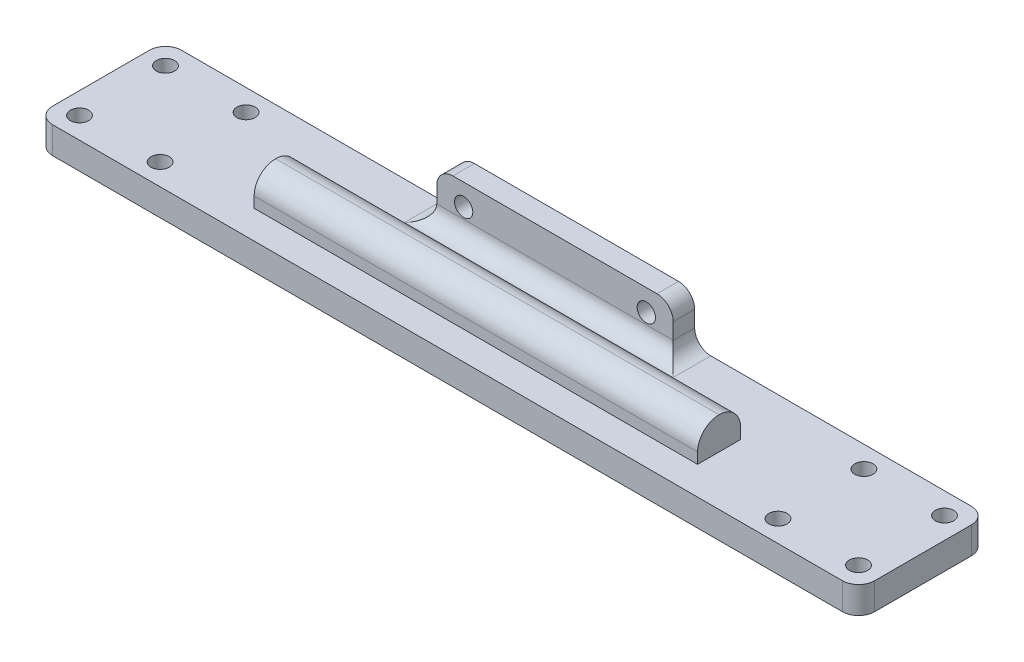
ISO-10303-21;
HEADER;
FILE_DESCRIPTION(('STEP AP214'),'2;1');
FILE_NAME('part.step','',(''),(''),'','','');
FILE_SCHEMA(('AUTOMOTIVE_DESIGN { 1 0 10303 214 1 1 1 1 }'));
ENDSEC;
DATA;
#1=APPLICATION_CONTEXT('core data for automotive mechanical design processes');
#2=APPLICATION_PROTOCOL_DEFINITION('international standard','automotive_design',2000,#1);
#3=PRODUCT_CONTEXT('',#1,'mechanical');
#4=PRODUCT('Part','Part','',(#3));
#5=PRODUCT_RELATED_PRODUCT_CATEGORY('part','',(#4));
#6=PRODUCT_DEFINITION_FORMATION('','',#4);
#7=PRODUCT_DEFINITION_CONTEXT('part definition',#1,'design');
#8=PRODUCT_DEFINITION('design','',#6,#7);
#9=PRODUCT_DEFINITION_SHAPE('','',#8);
#10=(LENGTH_UNIT() NAMED_UNIT(*) SI_UNIT(.MILLI.,.METRE.));
#11=(NAMED_UNIT(*) PLANE_ANGLE_UNIT() SI_UNIT($,.RADIAN.));
#12=(NAMED_UNIT(*) SI_UNIT($,.STERADIAN.) SOLID_ANGLE_UNIT());
#13=UNCERTAINTY_MEASURE_WITH_UNIT(LENGTH_MEASURE(1.E-05),#10,'distance_accuracy_value','');
#14=(GEOMETRIC_REPRESENTATION_CONTEXT(3) GLOBAL_UNCERTAINTY_ASSIGNED_CONTEXT((#13)) GLOBAL_UNIT_ASSIGNED_CONTEXT((#10,
#11,#12)) REPRESENTATION_CONTEXT('',''));
#15=CARTESIAN_POINT('',(0.,0.,0.));
#16=DIRECTION('',(0.,0.,1.));
#17=DIRECTION('',(1.,0.,0.));
#18=AXIS2_PLACEMENT_3D('',#15,#16,#17);
#19=CARTESIAN_POINT('',(-76.5,5.,-12.));
#20=DIRECTION('',(0.,0.,1.));
#21=DIRECTION('',(1.,0.,0.));
#22=AXIS2_PLACEMENT_3D('',#19,#20,#21);
#23=PLANE('',#22);
#24=DIRECTION('',(0.,-1.,0.));
#25=VECTOR('',#24,1.);
#26=CARTESIAN_POINT('',(-22.,0.,-12.));
#27=LINE('',#26,#25);
#28=CARTESIAN_POINT('',(-22.,11.,-12.));
#29=VERTEX_POINT('',#28);
#30=CARTESIAN_POINT('',(-22.,8.,-12.));
#31=VERTEX_POINT('',#30);
#32=EDGE_CURVE('E523',#29,#31,#27,.T.);
#33=ORIENTED_EDGE('',*,*,#32,.F.);
#34=CARTESIAN_POINT('',(-19.,11.,-12.));
#35=DIRECTION('',(0.,0.,1.));
#36=DIRECTION('',(1.,0.,0.));
#37=AXIS2_PLACEMENT_3D('',#34,#35,#36);
#38=CIRCLE('',#37,3.);
#39=CARTESIAN_POINT('',(-19.,14.,-12.));
#40=VERTEX_POINT('',#39);
#41=EDGE_CURVE('E431',#29,#40,#38,.F.);
#42=ORIENTED_EDGE('',*,*,#41,.T.);
#43=DIRECTION('',(-1.,0.,0.));
#44=VECTOR('',#43,1.);
#45=CARTESIAN_POINT('',(0.,14.,-12.));
#46=LINE('',#45,#44);
#47=CARTESIAN_POINT('',(19.,14.,-12.));
#48=VERTEX_POINT('',#47);
#49=EDGE_CURVE('E527',#48,#40,#46,.T.);
#50=ORIENTED_EDGE('',*,*,#49,.F.);
#51=CARTESIAN_POINT('',(19.,11.,-12.));
#52=DIRECTION('',(0.,0.,1.));
#53=DIRECTION('',(1.,0.,0.));
#54=AXIS2_PLACEMENT_3D('',#51,#52,#53);
#55=CIRCLE('',#54,3.);
#56=CARTESIAN_POINT('',(22.,11.,-12.));
#57=VERTEX_POINT('',#56);
#58=EDGE_CURVE('E428',#48,#57,#55,.F.);
#59=ORIENTED_EDGE('',*,*,#58,.T.);
#60=DIRECTION('',(0.,-1.,0.));
#61=VECTOR('',#60,1.);
#62=CARTESIAN_POINT('',(22.,0.,-12.));
#63=LINE('',#62,#61);
#64=CARTESIAN_POINT('',(22.,8.,-12.));
#65=VERTEX_POINT('',#64);
#66=EDGE_CURVE('E506',#57,#65,#63,.T.);
#67=ORIENTED_EDGE('',*,*,#66,.T.);
#68=CARTESIAN_POINT('',(25.,8.,-12.));
#69=DIRECTION('',(0.,0.,1.));
#70=DIRECTION('',(1.,0.,0.));
#71=AXIS2_PLACEMENT_3D('',#68,#69,#70);
#72=CIRCLE('',#71,3.);
#73=CARTESIAN_POINT('',(25.,5.,-12.));
#74=VERTEX_POINT('',#73);
#75=EDGE_CURVE('E417',#65,#74,#72,.T.);
#76=ORIENTED_EDGE('',*,*,#75,.T.);
#77=DIRECTION('',(-1.,0.,0.));
#78=VECTOR('',#77,1.);
#79=CARTESIAN_POINT('',(53.5,5.,-12.));
#80=LINE('',#79,#78);
#81=CARTESIAN_POINT('',(73.5,5.,-12.));
#82=VERTEX_POINT('',#81);
#83=EDGE_CURVE('E309',#82,#74,#80,.T.);
#84=ORIENTED_EDGE('',*,*,#83,.F.);
#85=DIRECTION('',(0.,-1.,0.));
#86=VECTOR('',#85,1.);
#87=CARTESIAN_POINT('',(73.5,5.,-12.));
#88=LINE('',#87,#86);
#89=CARTESIAN_POINT('',(73.5,0.,-12.));
#90=VERTEX_POINT('',#89);
#91=EDGE_CURVE('E372',#82,#90,#88,.T.);
#92=ORIENTED_EDGE('',*,*,#91,.T.);
#93=DIRECTION('',(-1.,0.,0.));
#94=VECTOR('',#93,1.);
#95=CARTESIAN_POINT('',(-76.5,0.,-12.));
#96=LINE('',#95,#94);
#97=CARTESIAN_POINT('',(-73.5,0.,-12.));
#98=VERTEX_POINT('',#97);
#99=EDGE_CURVE('E320',#90,#98,#96,.T.);
#100=ORIENTED_EDGE('',*,*,#99,.T.);
#101=DIRECTION('',(0.,-1.,0.));
#102=VECTOR('',#101,1.);
#103=CARTESIAN_POINT('',(-73.5,5.,-12.));
#104=LINE('',#103,#102);
#105=CARTESIAN_POINT('',(-73.4999999999999,5.,-12.));
#106=VERTEX_POINT('',#105);
#107=EDGE_CURVE('E368',#98,#106,#104,.F.);
#108=ORIENTED_EDGE('',*,*,#107,.T.);
#109=CARTESIAN_POINT('',(-25.,5.,-12.));
#110=VERTEX_POINT('',#109);
#111=EDGE_CURVE('E308',#110,#106,#80,.T.);
#112=ORIENTED_EDGE('',*,*,#111,.F.);
#113=CARTESIAN_POINT('',(-25.,8.,-12.));
#114=DIRECTION('',(0.,0.,1.));
#115=DIRECTION('',(1.,0.,0.));
#116=AXIS2_PLACEMENT_3D('',#113,#114,#115);
#117=CIRCLE('',#116,3.);
#118=EDGE_CURVE('E420',#110,#31,#117,.T.);
#119=ORIENTED_EDGE('',*,*,#118,.T.);
#120=EDGE_LOOP('',(#33,#42,#50,#59,#67,#76,#84,#92,#100,#108,#112,#119));
#121=FACE_BOUND('',#120,.T.);
#122=CARTESIAN_POINT('',(-17.,10.,-12.));
#123=DIRECTION('',(0.,0.,-1.));
#124=DIRECTION('',(-1.,0.,0.));
#125=AXIS2_PLACEMENT_3D('',#122,#123,#124);
#126=CIRCLE('',#125,1.7);
#127=CARTESIAN_POINT('',(-18.7,10.,-12.));
#128=VERTEX_POINT('',#127);
#129=EDGE_CURVE('E1001',#128,#128,#126,.F.);
#130=ORIENTED_EDGE('',*,*,#129,.T.);
#131=EDGE_LOOP('',(#130));
#132=FACE_BOUND('',#131,.T.);
#133=CARTESIAN_POINT('',(17.,10.,-12.));
#134=DIRECTION('',(0.,0.,-1.));
#135=DIRECTION('',(-1.,0.,0.));
#136=AXIS2_PLACEMENT_3D('',#133,#134,#135);
#137=CIRCLE('',#136,1.7);
#138=CARTESIAN_POINT('',(15.3,10.,-12.));
#139=VERTEX_POINT('',#138);
#140=EDGE_CURVE('E1004',#139,#139,#137,.T.);
#141=ORIENTED_EDGE('',*,*,#140,.F.);
#142=EDGE_LOOP('',(#141));
#143=FACE_BOUND('',#142,.T.);
#144=ADVANCED_FACE('F45',(#121,#132,#143),#23,.F.);
#145=CARTESIAN_POINT('',(0.,0.,-7.99999999999999));
#146=DIRECTION('',(0.,0.,-1.));
#147=DIRECTION('',(-1.,0.,0.));
#148=AXIS2_PLACEMENT_3D('',#145,#146,#147);
#149=PLANE('',#148);
#150=DIRECTION('',(0.,-1.,0.));
#151=VECTOR('',#150,1.);
#152=CARTESIAN_POINT('',(-22.,0.,-7.99999999999999));
#153=LINE('',#152,#151);
#154=CARTESIAN_POINT('',(-22.,11.,-7.99999999999999));
#155=VERTEX_POINT('',#154);
#156=CARTESIAN_POINT('',(-22.,8.,-7.99999999999999));
#157=VERTEX_POINT('',#156);
#158=EDGE_CURVE('E405',#155,#157,#153,.T.);
#159=ORIENTED_EDGE('',*,*,#158,.T.);
#160=DIRECTION('',(1.,0.,0.));
#161=VECTOR('',#160,1.);
#162=CARTESIAN_POINT('',(0.,8.,-7.99999999999999));
#163=LINE('',#162,#161);
#164=CARTESIAN_POINT('',(22.,8.,-7.99999999999999));
#165=VERTEX_POINT('',#164);
#166=EDGE_CURVE('E450',#157,#165,#163,.T.);
#167=ORIENTED_EDGE('',*,*,#166,.T.);
#168=DIRECTION('',(0.,-1.,0.));
#169=VECTOR('',#168,1.);
#170=CARTESIAN_POINT('',(22.,0.,-7.99999999999999));
#171=LINE('',#170,#169);
#172=CARTESIAN_POINT('',(22.,11.,-7.99999999999999));
#173=VERTEX_POINT('',#172);
#174=EDGE_CURVE('E512',#173,#165,#171,.T.);
#175=ORIENTED_EDGE('',*,*,#174,.F.);
#176=CARTESIAN_POINT('',(19.,11.,-7.99999999999999));
#177=DIRECTION('',(0.,0.,-1.));
#178=DIRECTION('',(-1.,0.,0.));
#179=AXIS2_PLACEMENT_3D('',#176,#177,#178);
#180=CIRCLE('',#179,3.);
#181=CARTESIAN_POINT('',(19.,14.,-7.99999999999999));
#182=VERTEX_POINT('',#181);
#183=EDGE_CURVE('E441',#173,#182,#180,.F.);
#184=ORIENTED_EDGE('',*,*,#183,.T.);
#185=DIRECTION('',(-1.,0.,0.));
#186=VECTOR('',#185,1.);
#187=CARTESIAN_POINT('',(0.,14.,-7.99999999999999));
#188=LINE('',#187,#186);
#189=CARTESIAN_POINT('',(-19.,14.,-7.99999999999999));
#190=VERTEX_POINT('',#189);
#191=EDGE_CURVE('E516',#182,#190,#188,.T.);
#192=ORIENTED_EDGE('',*,*,#191,.T.);
#193=CARTESIAN_POINT('',(-19.,11.,-7.99999999999999));
#194=DIRECTION('',(0.,0.,-1.));
#195=DIRECTION('',(-1.,0.,0.));
#196=AXIS2_PLACEMENT_3D('',#193,#194,#195);
#197=CIRCLE('',#196,3.);
#198=EDGE_CURVE('E444',#190,#155,#197,.F.);
#199=ORIENTED_EDGE('',*,*,#198,.T.);
#200=EDGE_LOOP('',(#159,#167,#175,#184,#192,#199));
#201=FACE_BOUND('',#200,.T.);
#202=CARTESIAN_POINT('',(-17.,10.,-7.99999999999999));
#203=DIRECTION('',(0.,0.,-1.));
#204=DIRECTION('',(-1.,0.,0.));
#205=AXIS2_PLACEMENT_3D('',#202,#203,#204);
#206=CIRCLE('',#205,1.7);
#207=CARTESIAN_POINT('',(-18.7,10.,-7.99999999999999));
#208=VERTEX_POINT('',#207);
#209=EDGE_CURVE('E998',#208,#208,#206,.F.);
#210=ORIENTED_EDGE('',*,*,#209,.F.);
#211=EDGE_LOOP('',(#210));
#212=FACE_BOUND('',#211,.T.);
#213=CARTESIAN_POINT('',(17.,10.,-7.99999999999999));
#214=DIRECTION('',(0.,0.,-1.));
#215=DIRECTION('',(-1.,0.,0.));
#216=AXIS2_PLACEMENT_3D('',#213,#214,#215);
#217=CIRCLE('',#216,1.7);
#218=CARTESIAN_POINT('',(15.3,10.,-7.99999999999999));
#219=VERTEX_POINT('',#218);
#220=EDGE_CURVE('E531',#219,#219,#217,.T.);
#221=ORIENTED_EDGE('',*,*,#220,.T.);
#222=EDGE_LOOP('',(#221));
#223=FACE_BOUND('',#222,.T.);
#224=ADVANCED_FACE('F547',(#201,#212,#223),#149,.F.);
#225=CARTESIAN_POINT('',(0.,5.,0.));
#226=DIRECTION('',(0.,1.,0.));
#227=DIRECTION('',(0.,0.,1.));
#228=AXIS2_PLACEMENT_3D('',#225,#226,#227);
#229=PLANE('',#228);
#230=DIRECTION('',(0.,0.,1.));
#231=VECTOR('',#230,1.);
#232=CARTESIAN_POINT('',(41.2672641912079,5.,0.));
#233=LINE('',#232,#231);
#234=CARTESIAN_POINT('',(41.2672641912079,5.,-1.27721849439182));
#235=VERTEX_POINT('',#234);
#236=CARTESIAN_POINT('',(41.2672641912079,5.,6.72278150560818));
#237=VERTEX_POINT('',#236);
#238=EDGE_CURVE('E205',#235,#237,#233,.T.);
#239=ORIENTED_EDGE('',*,*,#238,.T.);
#240=DIRECTION('',(1.,0.,0.));
#241=VECTOR('',#240,1.);
#242=CARTESIAN_POINT('',(0.,5.,6.72278150560818));
#243=LINE('',#242,#241);
#244=CARTESIAN_POINT('',(-41.2672641912079,5.,6.72278150560818));
#245=VERTEX_POINT('',#244);
#246=EDGE_CURVE('E222',#245,#237,#243,.T.);
#247=ORIENTED_EDGE('',*,*,#246,.F.);
#248=DIRECTION('',(0.,0.,1.));
#249=VECTOR('',#248,1.);
#250=CARTESIAN_POINT('',(-41.2672641912079,5.,0.));
#251=LINE('',#250,#249);
#252=CARTESIAN_POINT('',(-41.2672641912079,5.,-1.27721849439182));
#253=VERTEX_POINT('',#252);
#254=EDGE_CURVE('E218',#253,#245,#251,.T.);
#255=ORIENTED_EDGE('',*,*,#254,.F.);
#256=DIRECTION('',(1.,0.,0.));
#257=VECTOR('',#256,1.);
#258=CARTESIAN_POINT('',(0.,5.,-1.27721849439182));
#259=LINE('',#258,#257);
#260=EDGE_CURVE('E194',#253,#235,#259,.T.);
#261=ORIENTED_EDGE('',*,*,#260,.T.);
#262=EDGE_LOOP('',(#239,#247,#255,#261));
#263=FACE_BOUND('',#262,.T.);
#264=CARTESIAN_POINT('',(72.5,5.,7.99999999999999));
#265=DIRECTION('',(0.,1.,0.));
#266=DIRECTION('',(0.,0.,1.));
#267=AXIS2_PLACEMENT_3D('',#264,#265,#266);
#268=CIRCLE('',#267,1.7);
#269=CARTESIAN_POINT('',(72.5,5.,9.69999999999999));
#270=VERTEX_POINT('',#269);
#271=EDGE_CURVE('E243',#270,#270,#268,.T.);
#272=ORIENTED_EDGE('',*,*,#271,.F.);
#273=EDGE_LOOP('',(#272));
#274=FACE_BOUND('',#273,.T.);
#275=CARTESIAN_POINT('',(-57.5,5.,8.));
#276=DIRECTION('',(0.,1.,0.));
#277=DIRECTION('',(0.,0.,1.));
#278=AXIS2_PLACEMENT_3D('',#275,#276,#277);
#279=CIRCLE('',#278,1.7);
#280=CARTESIAN_POINT('',(-57.5,5.,9.7));
#281=VERTEX_POINT('',#280);
#282=EDGE_CURVE('E259',#281,#281,#279,.T.);
#283=ORIENTED_EDGE('',*,*,#282,.F.);
#284=EDGE_LOOP('',(#283));
#285=FACE_BOUND('',#284,.T.);
#286=CARTESIAN_POINT('',(-72.5,5.,-7.99999999999999));
#287=DIRECTION('',(0.,1.,0.));
#288=DIRECTION('',(0.,0.,1.));
#289=AXIS2_PLACEMENT_3D('',#286,#287,#288);
#290=CIRCLE('',#289,1.7);
#291=CARTESIAN_POINT('',(-72.5,5.,-6.29999999999999));
#292=VERTEX_POINT('',#291);
#293=EDGE_CURVE('E275',#292,#292,#290,.T.);
#294=ORIENTED_EDGE('',*,*,#293,.F.);
#295=EDGE_LOOP('',(#294));
#296=FACE_BOUND('',#295,.T.);
#297=CARTESIAN_POINT('',(57.5,5.,-8.));
#298=DIRECTION('',(0.,1.,0.));
#299=DIRECTION('',(0.,0.,1.));
#300=AXIS2_PLACEMENT_3D('',#297,#298,#299);
#301=CIRCLE('',#300,1.7);
#302=CARTESIAN_POINT('',(57.5,5.,-6.3));
#303=VERTEX_POINT('',#302);
#304=EDGE_CURVE('E291',#303,#303,#301,.T.);
#305=ORIENTED_EDGE('',*,*,#304,.F.);
#306=EDGE_LOOP('',(#305));
#307=FACE_BOUND('',#306,.T.);
#308=CARTESIAN_POINT('',(72.5,5.,-8.));
#309=DIRECTION('',(0.,1.,0.));
#310=DIRECTION('',(0.,0.,1.));
#311=AXIS2_PLACEMENT_3D('',#308,#309,#310);
#312=CIRCLE('',#311,1.7);
#313=CARTESIAN_POINT('',(72.5,5.,-6.3));
#314=VERTEX_POINT('',#313);
#315=EDGE_CURVE('E283',#314,#314,#312,.T.);
#316=ORIENTED_EDGE('',*,*,#315,.F.);
#317=EDGE_LOOP('',(#316));
#318=FACE_BOUND('',#317,.T.);
#319=CARTESIAN_POINT('',(-57.5,5.,-7.99999999999999));
#320=DIRECTION('',(0.,1.,0.));
#321=DIRECTION('',(0.,0.,1.));
#322=AXIS2_PLACEMENT_3D('',#319,#320,#321);
#323=CIRCLE('',#322,1.7);
#324=CARTESIAN_POINT('',(-57.5,5.,-6.29999999999999));
#325=VERTEX_POINT('',#324);
#326=EDGE_CURVE('E267',#325,#325,#323,.T.);
#327=ORIENTED_EDGE('',*,*,#326,.F.);
#328=EDGE_LOOP('',(#327));
#329=FACE_BOUND('',#328,.T.);
#330=CARTESIAN_POINT('',(-72.5,5.,8.));
#331=DIRECTION('',(0.,1.,0.));
#332=DIRECTION('',(0.,0.,1.));
#333=AXIS2_PLACEMENT_3D('',#330,#331,#332);
#334=CIRCLE('',#333,1.7);
#335=CARTESIAN_POINT('',(-72.5,5.,9.7));
#336=VERTEX_POINT('',#335);
#337=EDGE_CURVE('E251',#336,#336,#334,.T.);
#338=ORIENTED_EDGE('',*,*,#337,.F.);
#339=EDGE_LOOP('',(#338));
#340=FACE_BOUND('',#339,.T.);
#341=CARTESIAN_POINT('',(57.5,5.,7.99999999999999));
#342=DIRECTION('',(0.,1.,0.));
#343=DIRECTION('',(0.,0.,1.));
#344=AXIS2_PLACEMENT_3D('',#341,#342,#343);
#345=CIRCLE('',#344,1.7);
#346=CARTESIAN_POINT('',(57.5,5.,9.69999999999999));
#347=VERTEX_POINT('',#346);
#348=EDGE_CURVE('E235',#347,#347,#345,.T.);
#349=ORIENTED_EDGE('',*,*,#348,.F.);
#350=EDGE_LOOP('',(#349));
#351=FACE_BOUND('',#350,.T.);
#352=DIRECTION('',(0.,0.,-1.));
#353=VECTOR('',#352,1.);
#354=CARTESIAN_POINT('',(25.,5.,-7.99999999999999));
#355=LINE('',#354,#353);
#356=CARTESIAN_POINT('',(25.,5.,-4.99999999999999));
#357=VERTEX_POINT('',#356);
#358=EDGE_CURVE('E61',#74,#357,#355,.F.);
#359=ORIENTED_EDGE('',*,*,#358,.T.);
#360=DIRECTION('',(1.,0.,0.));
#361=VECTOR('',#360,1.);
#362=CARTESIAN_POINT('',(0.,5.,-4.99999999999999));
#363=LINE('',#362,#361);
#364=CARTESIAN_POINT('',(-25.,5.,-4.99999999999999));
#365=VERTEX_POINT('',#364);
#366=EDGE_CURVE('E454',#357,#365,#363,.F.);
#367=ORIENTED_EDGE('',*,*,#366,.T.);
#368=DIRECTION('',(0.,0.,-1.));
#369=VECTOR('',#368,1.);
#370=CARTESIAN_POINT('',(-25.,5.,0.));
#371=LINE('',#370,#369);
#372=EDGE_CURVE('E68',#365,#110,#371,.T.);
#373=ORIENTED_EDGE('',*,*,#372,.T.);
#374=ORIENTED_EDGE('',*,*,#111,.T.);
#375=CARTESIAN_POINT('',(-73.5,5.,-8.99999999999999));
#376=DIRECTION('',(0.,1.,0.));
#377=DIRECTION('',(0.,0.,1.));
#378=AXIS2_PLACEMENT_3D('',#375,#376,#377);
#379=CIRCLE('',#378,3.);
#380=CARTESIAN_POINT('',(-76.5,5.,-8.99999999999999));
#381=VERTEX_POINT('',#380);
#382=EDGE_CURVE('E359',#106,#381,#379,.T.);
#383=ORIENTED_EDGE('',*,*,#382,.T.);
#384=DIRECTION('',(0.,0.,1.));
#385=VECTOR('',#384,1.);
#386=CARTESIAN_POINT('',(-76.5,5.,12.));
#387=LINE('',#386,#385);
#388=CARTESIAN_POINT('',(-76.5,5.,9.));
#389=VERTEX_POINT('',#388);
#390=EDGE_CURVE('E312',#381,#389,#387,.T.);
#391=ORIENTED_EDGE('',*,*,#390,.T.);
#392=CARTESIAN_POINT('',(-73.5,5.,9.));
#393=DIRECTION('',(0.,1.,0.));
#394=DIRECTION('',(0.,0.,1.));
#395=AXIS2_PLACEMENT_3D('',#392,#393,#394);
#396=CIRCLE('',#395,3.);
#397=CARTESIAN_POINT('',(-73.5,5.,12.));
#398=VERTEX_POINT('',#397);
#399=EDGE_CURVE('E356',#389,#398,#396,.T.);
#400=ORIENTED_EDGE('',*,*,#399,.T.);
#401=DIRECTION('',(1.,0.,0.));
#402=VECTOR('',#401,1.);
#403=CARTESIAN_POINT('',(-53.5,5.,12.));
#404=LINE('',#403,#402);
#405=CARTESIAN_POINT('',(73.5,5.,12.));
#406=VERTEX_POINT('',#405);
#407=EDGE_CURVE('E299',#398,#406,#404,.T.);
#408=ORIENTED_EDGE('',*,*,#407,.T.);
#409=CARTESIAN_POINT('',(73.5,5.,9.));
#410=DIRECTION('',(0.,1.,0.));
#411=DIRECTION('',(0.,0.,1.));
#412=AXIS2_PLACEMENT_3D('',#409,#410,#411);
#413=CIRCLE('',#412,3.);
#414=CARTESIAN_POINT('',(76.5,5.,9.));
#415=VERTEX_POINT('',#414);
#416=EDGE_CURVE('E365',#406,#415,#413,.T.);
#417=ORIENTED_EDGE('',*,*,#416,.T.);
#418=DIRECTION('',(0.,0.,-1.));
#419=VECTOR('',#418,1.);
#420=CARTESIAN_POINT('',(76.5,5.,12.));
#421=LINE('',#420,#419);
#422=CARTESIAN_POINT('',(76.5,5.,-8.99999999999999));
#423=VERTEX_POINT('',#422);
#424=EDGE_CURVE('E303',#415,#423,#421,.T.);
#425=ORIENTED_EDGE('',*,*,#424,.T.);
#426=CARTESIAN_POINT('',(73.5,5.,-8.99999999999999));
#427=DIRECTION('',(0.,1.,0.));
#428=DIRECTION('',(0.,0.,1.));
#429=AXIS2_PLACEMENT_3D('',#426,#427,#428);
#430=CIRCLE('',#429,3.);
#431=EDGE_CURVE('E362',#423,#82,#430,.T.);
#432=ORIENTED_EDGE('',*,*,#431,.T.);
#433=ORIENTED_EDGE('',*,*,#83,.T.);
#434=EDGE_LOOP('',(#359,#367,#373,#374,#383,#391,#400,#408,#417,#425,#432,#433));
#435=FACE_BOUND('',#434,.T.);
#436=ADVANCED_FACE('F215',(#263,#274,#285,#296,#307,#318,#329,#340,#351,#435),#229,.T.);
#437=CARTESIAN_POINT('',(0.,0.,0.));
#438=DIRECTION('',(0.,1.,0.));
#439=DIRECTION('',(0.,0.,1.));
#440=AXIS2_PLACEMENT_3D('',#437,#438,#439);
#441=PLANE('',#440);
#442=DIRECTION('',(0.,0.,-1.));
#443=VECTOR('',#442,1.);
#444=CARTESIAN_POINT('',(76.5,0.,12.));
#445=LINE('',#444,#443);
#446=CARTESIAN_POINT('',(76.5,0.,9.));
#447=VERTEX_POINT('',#446);
#448=CARTESIAN_POINT('',(76.5,0.,-8.99999999999999));
#449=VERTEX_POINT('',#448);
#450=EDGE_CURVE('E295',#447,#449,#445,.T.);
#451=ORIENTED_EDGE('',*,*,#450,.F.);
#452=CARTESIAN_POINT('',(73.5,0.,9.));
#453=DIRECTION('',(0.,1.,0.));
#454=DIRECTION('',(0.,0.,1.));
#455=AXIS2_PLACEMENT_3D('',#452,#453,#454);
#456=CIRCLE('',#455,3.);
#457=CARTESIAN_POINT('',(73.5,0.,12.));
#458=VERTEX_POINT('',#457);
#459=EDGE_CURVE('E346',#447,#458,#456,.F.);
#460=ORIENTED_EDGE('',*,*,#459,.T.);
#461=DIRECTION('',(1.,0.,0.));
#462=VECTOR('',#461,1.);
#463=CARTESIAN_POINT('',(-76.5,0.,12.));
#464=LINE('',#463,#462);
#465=CARTESIAN_POINT('',(-73.5,0.,12.));
#466=VERTEX_POINT('',#465);
#467=EDGE_CURVE('E304',#466,#458,#464,.T.);
#468=ORIENTED_EDGE('',*,*,#467,.F.);
#469=CARTESIAN_POINT('',(-73.5,0.,9.));
#470=DIRECTION('',(0.,1.,0.));
#471=DIRECTION('',(0.,0.,1.));
#472=AXIS2_PLACEMENT_3D('',#469,#470,#471);
#473=CIRCLE('',#472,3.);
#474=CARTESIAN_POINT('',(-76.5,0.,9.));
#475=VERTEX_POINT('',#474);
#476=EDGE_CURVE('E337',#466,#475,#473,.F.);
#477=ORIENTED_EDGE('',*,*,#476,.T.);
#478=DIRECTION('',(0.,0.,1.));
#479=VECTOR('',#478,1.);
#480=CARTESIAN_POINT('',(-76.5,0.,12.));
#481=LINE('',#480,#479);
#482=CARTESIAN_POINT('',(-76.5,0.,-8.99999999999999));
#483=VERTEX_POINT('',#482);
#484=EDGE_CURVE('E324',#483,#475,#481,.T.);
#485=ORIENTED_EDGE('',*,*,#484,.F.);
#486=CARTESIAN_POINT('',(-73.5,0.,-8.99999999999999));
#487=DIRECTION('',(0.,1.,0.));
#488=DIRECTION('',(0.,0.,1.));
#489=AXIS2_PLACEMENT_3D('',#486,#487,#488);
#490=CIRCLE('',#489,3.);
#491=EDGE_CURVE('E340',#483,#98,#490,.F.);
#492=ORIENTED_EDGE('',*,*,#491,.T.);
#493=ORIENTED_EDGE('',*,*,#99,.F.);
#494=CARTESIAN_POINT('',(73.5,0.,-8.99999999999999));
#495=DIRECTION('',(0.,1.,0.));
#496=DIRECTION('',(0.,0.,1.));
#497=AXIS2_PLACEMENT_3D('',#494,#495,#496);
#498=CIRCLE('',#497,3.);
#499=EDGE_CURVE('E343',#90,#449,#498,.F.);
#500=ORIENTED_EDGE('',*,*,#499,.T.);
#501=EDGE_LOOP('',(#451,#460,#468,#477,#485,#492,#493,#500));
#502=FACE_BOUND('',#501,.T.);
#503=CARTESIAN_POINT('',(57.5,0.,-8.));
#504=DIRECTION('',(0.,1.,0.));
#505=DIRECTION('',(0.,0.,1.));
#506=AXIS2_PLACEMENT_3D('',#503,#504,#505);
#507=CIRCLE('',#506,1.7);
#508=CARTESIAN_POINT('',(57.5,0.,-6.3));
#509=VERTEX_POINT('',#508);
#510=EDGE_CURVE('E287',#509,#509,#507,.T.);
#511=ORIENTED_EDGE('',*,*,#510,.T.);
#512=EDGE_LOOP('',(#511));
#513=FACE_BOUND('',#512,.T.);
#514=CARTESIAN_POINT('',(72.5,0.,-8.));
#515=DIRECTION('',(0.,1.,0.));
#516=DIRECTION('',(0.,0.,1.));
#517=AXIS2_PLACEMENT_3D('',#514,#515,#516);
#518=CIRCLE('',#517,1.7);
#519=CARTESIAN_POINT('',(72.5,0.,-6.3));
#520=VERTEX_POINT('',#519);
#521=EDGE_CURVE('E279',#520,#520,#518,.T.);
#522=ORIENTED_EDGE('',*,*,#521,.T.);
#523=EDGE_LOOP('',(#522));
#524=FACE_BOUND('',#523,.T.);
#525=CARTESIAN_POINT('',(-72.5,0.,-7.99999999999999));
#526=DIRECTION('',(0.,1.,0.));
#527=DIRECTION('',(0.,0.,1.));
#528=AXIS2_PLACEMENT_3D('',#525,#526,#527);
#529=CIRCLE('',#528,1.7);
#530=CARTESIAN_POINT('',(-72.5,0.,-6.29999999999999));
#531=VERTEX_POINT('',#530);
#532=EDGE_CURVE('E271',#531,#531,#529,.T.);
#533=ORIENTED_EDGE('',*,*,#532,.T.);
#534=EDGE_LOOP('',(#533));
#535=FACE_BOUND('',#534,.T.);
#536=CARTESIAN_POINT('',(-57.5,0.,-7.99999999999999));
#537=DIRECTION('',(0.,1.,0.));
#538=DIRECTION('',(0.,0.,1.));
#539=AXIS2_PLACEMENT_3D('',#536,#537,#538);
#540=CIRCLE('',#539,1.7);
#541=CARTESIAN_POINT('',(-57.5,0.,-6.29999999999999));
#542=VERTEX_POINT('',#541);
#543=EDGE_CURVE('E263',#542,#542,#540,.T.);
#544=ORIENTED_EDGE('',*,*,#543,.T.);
#545=EDGE_LOOP('',(#544));
#546=FACE_BOUND('',#545,.T.);
#547=CARTESIAN_POINT('',(-57.5,0.,8.));
#548=DIRECTION('',(0.,1.,0.));
#549=DIRECTION('',(0.,0.,1.));
#550=AXIS2_PLACEMENT_3D('',#547,#548,#549);
#551=CIRCLE('',#550,1.7);
#552=CARTESIAN_POINT('',(-57.5,0.,9.7));
#553=VERTEX_POINT('',#552);
#554=EDGE_CURVE('E255',#553,#553,#551,.T.);
#555=ORIENTED_EDGE('',*,*,#554,.T.);
#556=EDGE_LOOP('',(#555));
#557=FACE_BOUND('',#556,.T.);
#558=CARTESIAN_POINT('',(-72.5,0.,8.));
#559=DIRECTION('',(0.,1.,0.));
#560=DIRECTION('',(0.,0.,1.));
#561=AXIS2_PLACEMENT_3D('',#558,#559,#560);
#562=CIRCLE('',#561,1.7);
#563=CARTESIAN_POINT('',(-72.5,0.,9.7));
#564=VERTEX_POINT('',#563);
#565=EDGE_CURVE('E247',#564,#564,#562,.T.);
#566=ORIENTED_EDGE('',*,*,#565,.T.);
#567=EDGE_LOOP('',(#566));
#568=FACE_BOUND('',#567,.T.);
#569=CARTESIAN_POINT('',(72.5,0.,7.99999999999999));
#570=DIRECTION('',(0.,1.,0.));
#571=DIRECTION('',(0.,0.,1.));
#572=AXIS2_PLACEMENT_3D('',#569,#570,#571);
#573=CIRCLE('',#572,1.7);
#574=CARTESIAN_POINT('',(72.5,0.,9.69999999999999));
#575=VERTEX_POINT('',#574);
#576=EDGE_CURVE('E239',#575,#575,#573,.T.);
#577=ORIENTED_EDGE('',*,*,#576,.T.);
#578=EDGE_LOOP('',(#577));
#579=FACE_BOUND('',#578,.T.);
#580=CARTESIAN_POINT('',(57.5,0.,7.99999999999999));
#581=DIRECTION('',(0.,1.,0.));
#582=DIRECTION('',(0.,0.,1.));
#583=AXIS2_PLACEMENT_3D('',#580,#581,#582);
#584=CIRCLE('',#583,1.7);
#585=CARTESIAN_POINT('',(57.5,0.,9.69999999999999));
#586=VERTEX_POINT('',#585);
#587=EDGE_CURVE('E201',#586,#586,#584,.T.);
#588=ORIENTED_EDGE('',*,*,#587,.T.);
#589=EDGE_LOOP('',(#588));
#590=FACE_BOUND('',#589,.T.);
#591=ADVANCED_FACE('F569',(#502,#513,#524,#535,#546,#557,#568,#579,#590),#441,.F.);
#592=CARTESIAN_POINT('',(76.5,5.,12.));
#593=DIRECTION('',(-1.,0.,0.));
#594=DIRECTION('',(0.,0.,1.));
#595=AXIS2_PLACEMENT_3D('',#592,#593,#594);
#596=PLANE('',#595);
#597=ORIENTED_EDGE('',*,*,#424,.F.);
#598=DIRECTION('',(0.,-1.,0.));
#599=VECTOR('',#598,1.);
#600=CARTESIAN_POINT('',(76.5,5.,9.));
#601=LINE('',#600,#599);
#602=EDGE_CURVE('E333',#415,#447,#601,.T.);
#603=ORIENTED_EDGE('',*,*,#602,.T.);
#604=ORIENTED_EDGE('',*,*,#450,.T.);
#605=DIRECTION('',(0.,-1.,0.));
#606=VECTOR('',#605,1.);
#607=CARTESIAN_POINT('',(76.5,5.,-8.99999999999999));
#608=LINE('',#607,#606);
#609=EDGE_CURVE('E316',#449,#423,#608,.F.);
#610=ORIENTED_EDGE('',*,*,#609,.T.);
#611=EDGE_LOOP('',(#597,#603,#604,#610));
#612=FACE_BOUND('',#611,.T.);
#613=ADVANCED_FACE('F498',(#612),#596,.F.);
#614=CARTESIAN_POINT('',(-76.5,5.,12.));
#615=DIRECTION('',(1.,0.,0.));
#616=DIRECTION('',(0.,0.,-1.));
#617=AXIS2_PLACEMENT_3D('',#614,#615,#616);
#618=PLANE('',#617);
#619=ORIENTED_EDGE('',*,*,#390,.F.);
#620=DIRECTION('',(0.,-1.,0.));
#621=VECTOR('',#620,1.);
#622=CARTESIAN_POINT('',(-76.5,5.,-8.99999999999999));
#623=LINE('',#622,#621);
#624=EDGE_CURVE('E379',#381,#483,#623,.T.);
#625=ORIENTED_EDGE('',*,*,#624,.T.);
#626=ORIENTED_EDGE('',*,*,#484,.T.);
#627=DIRECTION('',(0.,-1.,0.));
#628=VECTOR('',#627,1.);
#629=CARTESIAN_POINT('',(-76.5,5.,9.));
#630=LINE('',#629,#628);
#631=EDGE_CURVE('E376',#475,#389,#630,.F.);
#632=ORIENTED_EDGE('',*,*,#631,.T.);
#633=EDGE_LOOP('',(#619,#625,#626,#632));
#634=FACE_BOUND('',#633,.T.);
#635=ADVANCED_FACE('F480',(#634),#618,.F.);
#636=CARTESIAN_POINT('',(-76.5,5.,12.));
#637=DIRECTION('',(0.,0.,-1.));
#638=DIRECTION('',(-1.,0.,0.));
#639=AXIS2_PLACEMENT_3D('',#636,#637,#638);
#640=PLANE('',#639);
#641=ORIENTED_EDGE('',*,*,#467,.T.);
#642=DIRECTION('',(0.,-1.,0.));
#643=VECTOR('',#642,1.);
#644=CARTESIAN_POINT('',(73.5,5.,12.));
#645=LINE('',#644,#643);
#646=EDGE_CURVE('E353',#458,#406,#645,.F.);
#647=ORIENTED_EDGE('',*,*,#646,.T.);
#648=ORIENTED_EDGE('',*,*,#407,.F.);
#649=DIRECTION('',(0.,-1.,0.));
#650=VECTOR('',#649,1.);
#651=CARTESIAN_POINT('',(-73.5,5.,12.));
#652=LINE('',#651,#650);
#653=EDGE_CURVE('E349',#398,#466,#652,.T.);
#654=ORIENTED_EDGE('',*,*,#653,.T.);
#655=EDGE_LOOP('',(#641,#647,#648,#654));
#656=FACE_BOUND('',#655,.T.);
#657=ADVANCED_FACE('F489',(#656),#640,.F.);
#658=CARTESIAN_POINT('',(57.5,5.,-8.));
#659=DIRECTION('',(0.,-1.,0.));
#660=DIRECTION('',(0.,0.,-1.));
#661=AXIS2_PLACEMENT_3D('',#658,#659,#660);
#662=CYLINDRICAL_SURFACE('',#661,1.7);
#663=ORIENTED_EDGE('',*,*,#304,.T.);
#664=EDGE_LOOP('',(#663));
#665=FACE_BOUND('',#664,.T.);
#666=ORIENTED_EDGE('',*,*,#510,.F.);
#667=EDGE_LOOP('',(#666));
#668=FACE_BOUND('',#667,.T.);
#669=ADVANCED_FACE('F649',(#665,#668),#662,.F.);
#670=CARTESIAN_POINT('',(72.5,5.,-8.));
#671=DIRECTION('',(0.,-1.,0.));
#672=DIRECTION('',(0.,0.,-1.));
#673=AXIS2_PLACEMENT_3D('',#670,#671,#672);
#674=CYLINDRICAL_SURFACE('',#673,1.7);
#675=ORIENTED_EDGE('',*,*,#315,.T.);
#676=EDGE_LOOP('',(#675));
#677=FACE_BOUND('',#676,.T.);
#678=ORIENTED_EDGE('',*,*,#521,.F.);
#679=EDGE_LOOP('',(#678));
#680=FACE_BOUND('',#679,.T.);
#681=ADVANCED_FACE('F645',(#677,#680),#674,.F.);
#682=CARTESIAN_POINT('',(-72.5,5.,-7.99999999999999));
#683=DIRECTION('',(0.,-1.,0.));
#684=DIRECTION('',(0.,0.,-1.));
#685=AXIS2_PLACEMENT_3D('',#682,#683,#684);
#686=CYLINDRICAL_SURFACE('',#685,1.7);
#687=ORIENTED_EDGE('',*,*,#293,.T.);
#688=EDGE_LOOP('',(#687));
#689=FACE_BOUND('',#688,.T.);
#690=ORIENTED_EDGE('',*,*,#532,.F.);
#691=EDGE_LOOP('',(#690));
#692=FACE_BOUND('',#691,.T.);
#693=ADVANCED_FACE('F641',(#689,#692),#686,.F.);
#694=CARTESIAN_POINT('',(-57.5,5.,-7.99999999999999));
#695=DIRECTION('',(0.,-1.,0.));
#696=DIRECTION('',(0.,0.,-1.));
#697=AXIS2_PLACEMENT_3D('',#694,#695,#696);
#698=CYLINDRICAL_SURFACE('',#697,1.7);
#699=ORIENTED_EDGE('',*,*,#326,.T.);
#700=EDGE_LOOP('',(#699));
#701=FACE_BOUND('',#700,.T.);
#702=ORIENTED_EDGE('',*,*,#543,.F.);
#703=EDGE_LOOP('',(#702));
#704=FACE_BOUND('',#703,.T.);
#705=ADVANCED_FACE('F637',(#701,#704),#698,.F.);
#706=CARTESIAN_POINT('',(-57.5,5.,8.));
#707=DIRECTION('',(0.,-1.,0.));
#708=DIRECTION('',(0.,0.,-1.));
#709=AXIS2_PLACEMENT_3D('',#706,#707,#708);
#710=CYLINDRICAL_SURFACE('',#709,1.7);
#711=ORIENTED_EDGE('',*,*,#282,.T.);
#712=EDGE_LOOP('',(#711));
#713=FACE_BOUND('',#712,.T.);
#714=ORIENTED_EDGE('',*,*,#554,.F.);
#715=EDGE_LOOP('',(#714));
#716=FACE_BOUND('',#715,.T.);
#717=ADVANCED_FACE('F633',(#713,#716),#710,.F.);
#718=CARTESIAN_POINT('',(-72.5,5.,8.));
#719=DIRECTION('',(0.,-1.,0.));
#720=DIRECTION('',(0.,0.,-1.));
#721=AXIS2_PLACEMENT_3D('',#718,#719,#720);
#722=CYLINDRICAL_SURFACE('',#721,1.7);
#723=ORIENTED_EDGE('',*,*,#337,.T.);
#724=EDGE_LOOP('',(#723));
#725=FACE_BOUND('',#724,.T.);
#726=ORIENTED_EDGE('',*,*,#565,.F.);
#727=EDGE_LOOP('',(#726));
#728=FACE_BOUND('',#727,.T.);
#729=ADVANCED_FACE('F629',(#725,#728),#722,.F.);
#730=CARTESIAN_POINT('',(72.5,5.,7.99999999999999));
#731=DIRECTION('',(0.,-1.,0.));
#732=DIRECTION('',(0.,0.,-1.));
#733=AXIS2_PLACEMENT_3D('',#730,#731,#732);
#734=CYLINDRICAL_SURFACE('',#733,1.7);
#735=ORIENTED_EDGE('',*,*,#271,.T.);
#736=EDGE_LOOP('',(#735));
#737=FACE_BOUND('',#736,.T.);
#738=ORIENTED_EDGE('',*,*,#576,.F.);
#739=EDGE_LOOP('',(#738));
#740=FACE_BOUND('',#739,.T.);
#741=ADVANCED_FACE('F625',(#737,#740),#734,.F.);
#742=CARTESIAN_POINT('',(57.5,5.,7.99999999999999));
#743=DIRECTION('',(0.,-1.,0.));
#744=DIRECTION('',(0.,0.,-1.));
#745=AXIS2_PLACEMENT_3D('',#742,#743,#744);
#746=CYLINDRICAL_SURFACE('',#745,1.7);
#747=ORIENTED_EDGE('',*,*,#348,.T.);
#748=EDGE_LOOP('',(#747));
#749=FACE_BOUND('',#748,.T.);
#750=ORIENTED_EDGE('',*,*,#587,.F.);
#751=EDGE_LOOP('',(#750));
#752=FACE_BOUND('',#751,.T.);
#753=ADVANCED_FACE('F572',(#749,#752),#746,.F.);
#754=CARTESIAN_POINT('',(73.5,5.,9.));
#755=DIRECTION('',(0.,-1.,0.));
#756=DIRECTION('',(0.,0.,-1.));
#757=AXIS2_PLACEMENT_3D('',#754,#755,#756);
#758=CYLINDRICAL_SURFACE('',#757,3.);
#759=ORIENTED_EDGE('',*,*,#416,.F.);
#760=ORIENTED_EDGE('',*,*,#646,.F.);
#761=ORIENTED_EDGE('',*,*,#459,.F.);
#762=ORIENTED_EDGE('',*,*,#602,.F.);
#763=EDGE_LOOP('',(#759,#760,#761,#762));
#764=FACE_BOUND('',#763,.T.);
#765=ADVANCED_FACE('F493',(#764),#758,.T.);
#766=CARTESIAN_POINT('',(73.5,5.,-8.99999999999999));
#767=DIRECTION('',(0.,-1.,0.));
#768=DIRECTION('',(0.,0.,-1.));
#769=AXIS2_PLACEMENT_3D('',#766,#767,#768);
#770=CYLINDRICAL_SURFACE('',#769,3.);
#771=ORIENTED_EDGE('',*,*,#431,.F.);
#772=ORIENTED_EDGE('',*,*,#609,.F.);
#773=ORIENTED_EDGE('',*,*,#499,.F.);
#774=ORIENTED_EDGE('',*,*,#91,.F.);
#775=EDGE_LOOP('',(#771,#772,#773,#774));
#776=FACE_BOUND('',#775,.T.);
#777=ADVANCED_FACE('F502',(#776),#770,.T.);
#778=CARTESIAN_POINT('',(-73.5,5.,-8.99999999999999));
#779=DIRECTION('',(0.,-1.,0.));
#780=DIRECTION('',(0.,0.,-1.));
#781=AXIS2_PLACEMENT_3D('',#778,#779,#780);
#782=CYLINDRICAL_SURFACE('',#781,3.);
#783=ORIENTED_EDGE('',*,*,#382,.F.);
#784=ORIENTED_EDGE('',*,*,#107,.F.);
#785=ORIENTED_EDGE('',*,*,#491,.F.);
#786=ORIENTED_EDGE('',*,*,#624,.F.);
#787=EDGE_LOOP('',(#783,#784,#785,#786));
#788=FACE_BOUND('',#787,.T.);
#789=ADVANCED_FACE('F476',(#788),#782,.T.);
#790=CARTESIAN_POINT('',(-73.5,5.,9.));
#791=DIRECTION('',(0.,-1.,0.));
#792=DIRECTION('',(0.,0.,-1.));
#793=AXIS2_PLACEMENT_3D('',#790,#791,#792);
#794=CYLINDRICAL_SURFACE('',#793,3.);
#795=ORIENTED_EDGE('',*,*,#399,.F.);
#796=ORIENTED_EDGE('',*,*,#631,.F.);
#797=ORIENTED_EDGE('',*,*,#476,.F.);
#798=ORIENTED_EDGE('',*,*,#653,.F.);
#799=EDGE_LOOP('',(#795,#796,#797,#798));
#800=FACE_BOUND('',#799,.T.);
#801=ADVANCED_FACE('F484',(#800),#794,.T.);
#802=CARTESIAN_POINT('',(41.2672641912079,11.,0.));
#803=DIRECTION('',(1.,0.,0.));
#804=DIRECTION('',(0.,0.,-1.));
#805=AXIS2_PLACEMENT_3D('',#802,#803,#804);
#806=PLANE('',#805);
#807=CARTESIAN_POINT('',(41.2672641912079,7.,2.72278150560818));
#808=DIRECTION('',(1.,0.,0.));
#809=DIRECTION('',(0.,0.,-1.));
#810=AXIS2_PLACEMENT_3D('',#807,#808,#809);
#811=CIRCLE('',#810,4.);
#812=CARTESIAN_POINT('',(41.2672641912079,7.,-1.27721849439182));
#813=VERTEX_POINT('',#812);
#814=CARTESIAN_POINT('',(41.2672641912079,11.,2.72278150560818));
#815=VERTEX_POINT('',#814);
#816=EDGE_CURVE('E383',#813,#815,#811,.T.);
#817=ORIENTED_EDGE('',*,*,#816,.T.);
#818=CARTESIAN_POINT('',(41.2672641912079,7.,2.72278150560818));
#819=DIRECTION('',(1.,0.,0.));
#820=DIRECTION('',(0.,0.,-1.));
#821=AXIS2_PLACEMENT_3D('',#818,#819,#820);
#822=CIRCLE('',#821,4.);
#823=CARTESIAN_POINT('',(41.2672641912079,7.,6.72278150560818));
#824=VERTEX_POINT('',#823);
#825=EDGE_CURVE('E386',#815,#824,#822,.T.);
#826=ORIENTED_EDGE('',*,*,#825,.T.);
#827=DIRECTION('',(0.,-1.,0.));
#828=VECTOR('',#827,1.);
#829=CARTESIAN_POINT('',(41.2672641912079,11.,6.72278150560818));
#830=LINE('',#829,#828);
#831=EDGE_CURVE('E208',#824,#237,#830,.T.);
#832=ORIENTED_EDGE('',*,*,#831,.T.);
#833=ORIENTED_EDGE('',*,*,#238,.F.);
#834=DIRECTION('',(0.,-1.,0.));
#835=VECTOR('',#834,1.);
#836=CARTESIAN_POINT('',(41.2672641912079,11.,-1.27721849439182));
#837=LINE('',#836,#835);
#838=EDGE_CURVE('E189',#813,#235,#837,.T.);
#839=ORIENTED_EDGE('',*,*,#838,.F.);
#840=EDGE_LOOP('',(#817,#826,#832,#833,#839));
#841=FACE_BOUND('',#840,.T.);
#842=ADVANCED_FACE('F206',(#841),#806,.T.);
#843=CARTESIAN_POINT('',(0.,11.,-1.27721849439182));
#844=DIRECTION('',(0.,0.,-1.));
#845=DIRECTION('',(-1.,0.,0.));
#846=AXIS2_PLACEMENT_3D('',#843,#844,#845);
#847=PLANE('',#846);
#848=DIRECTION('',(0.,-1.,0.));
#849=VECTOR('',#848,1.);
#850=CARTESIAN_POINT('',(-41.2672641912079,11.,-1.27721849439182));
#851=LINE('',#850,#849);
#852=CARTESIAN_POINT('',(-41.2672641912079,7.,-1.27721849439182));
#853=VERTEX_POINT('',#852);
#854=EDGE_CURVE('E202',#853,#253,#851,.T.);
#855=ORIENTED_EDGE('',*,*,#854,.F.);
#856=DIRECTION('',(1.,0.,0.));
#857=VECTOR('',#856,1.);
#858=CARTESIAN_POINT('',(0.,7.,-1.27721849439182));
#859=LINE('',#858,#857);
#860=EDGE_CURVE('E197',#853,#813,#859,.T.);
#861=ORIENTED_EDGE('',*,*,#860,.T.);
#862=ORIENTED_EDGE('',*,*,#838,.T.);
#863=ORIENTED_EDGE('',*,*,#260,.F.);
#864=EDGE_LOOP('',(#855,#861,#862,#863));
#865=FACE_BOUND('',#864,.T.);
#866=ADVANCED_FACE('F192',(#865),#847,.T.);
#867=CARTESIAN_POINT('',(-41.2672641912079,11.,0.));
#868=DIRECTION('',(1.,0.,0.));
#869=DIRECTION('',(0.,0.,-1.));
#870=AXIS2_PLACEMENT_3D('',#867,#868,#869);
#871=PLANE('',#870);
#872=DIRECTION('',(0.,-1.,0.));
#873=VECTOR('',#872,1.);
#874=CARTESIAN_POINT('',(-41.2672641912079,11.,6.72278150560818));
#875=LINE('',#874,#873);
#876=CARTESIAN_POINT('',(-41.2672641912079,7.,6.72278150560818));
#877=VERTEX_POINT('',#876);
#878=EDGE_CURVE('E230',#877,#245,#875,.T.);
#879=ORIENTED_EDGE('',*,*,#878,.F.);
#880=CARTESIAN_POINT('',(-41.2672641912079,7.,2.72278150560818));
#881=DIRECTION('',(1.,0.,0.));
#882=DIRECTION('',(0.,0.,-1.));
#883=AXIS2_PLACEMENT_3D('',#880,#881,#882);
#884=CIRCLE('',#883,4.);
#885=CARTESIAN_POINT('',(-41.2672641912079,11.,2.72278150560818));
#886=VERTEX_POINT('',#885);
#887=EDGE_CURVE('E396',#877,#886,#884,.F.);
#888=ORIENTED_EDGE('',*,*,#887,.T.);
#889=CARTESIAN_POINT('',(-41.2672641912079,7.,2.72278150560818));
#890=DIRECTION('',(1.,0.,0.));
#891=DIRECTION('',(0.,0.,-1.));
#892=AXIS2_PLACEMENT_3D('',#889,#890,#891);
#893=CIRCLE('',#892,4.);
#894=EDGE_CURVE('E393',#886,#853,#893,.F.);
#895=ORIENTED_EDGE('',*,*,#894,.T.);
#896=ORIENTED_EDGE('',*,*,#854,.T.);
#897=ORIENTED_EDGE('',*,*,#254,.T.);
#898=EDGE_LOOP('',(#879,#888,#895,#896,#897));
#899=FACE_BOUND('',#898,.T.);
#900=ADVANCED_FACE('F614',(#899),#871,.F.);
#901=CARTESIAN_POINT('',(0.,11.,6.72278150560818));
#902=DIRECTION('',(0.,0.,-1.));
#903=DIRECTION('',(-1.,0.,0.));
#904=AXIS2_PLACEMENT_3D('',#901,#902,#903);
#905=PLANE('',#904);
#906=ORIENTED_EDGE('',*,*,#831,.F.);
#907=DIRECTION('',(1.,0.,0.));
#908=VECTOR('',#907,1.);
#909=CARTESIAN_POINT('',(-41.2672641912079,7.,6.72278150560818));
#910=LINE('',#909,#908);
#911=EDGE_CURVE('E389',#824,#877,#910,.F.);
#912=ORIENTED_EDGE('',*,*,#911,.T.);
#913=ORIENTED_EDGE('',*,*,#878,.T.);
#914=ORIENTED_EDGE('',*,*,#246,.T.);
#915=EDGE_LOOP('',(#906,#912,#913,#914));
#916=FACE_BOUND('',#915,.T.);
#917=ADVANCED_FACE('F586',(#916),#905,.F.);
#918=CARTESIAN_POINT('',(0.,7.,2.72278150560818));
#919=DIRECTION('',(1.,0.,0.));
#920=DIRECTION('',(0.,0.,-1.));
#921=AXIS2_PLACEMENT_3D('',#918,#919,#920);
#922=CYLINDRICAL_SURFACE('',#921,4.);
#923=ORIENTED_EDGE('',*,*,#860,.F.);
#924=ORIENTED_EDGE('',*,*,#894,.F.);
#925=DIRECTION('',(1.,0.,0.));
#926=VECTOR('',#925,1.);
#927=CARTESIAN_POINT('',(0.,11.,2.72278150560818));
#928=LINE('',#927,#926);
#929=EDGE_CURVE('E213',#815,#886,#928,.F.);
#930=ORIENTED_EDGE('',*,*,#929,.F.);
#931=ORIENTED_EDGE('',*,*,#816,.F.);
#932=EDGE_LOOP('',(#923,#924,#930,#931));
#933=FACE_BOUND('',#932,.T.);
#934=ADVANCED_FACE('F582',(#933),#922,.T.);
#935=CARTESIAN_POINT('',(0.,7.,2.72278150560818));
#936=DIRECTION('',(-1.,0.,0.));
#937=DIRECTION('',(0.,0.,1.));
#938=AXIS2_PLACEMENT_3D('',#935,#936,#937);
#939=CYLINDRICAL_SURFACE('',#938,4.);
#940=ORIENTED_EDGE('',*,*,#887,.F.);
#941=ORIENTED_EDGE('',*,*,#911,.F.);
#942=ORIENTED_EDGE('',*,*,#825,.F.);
#943=ORIENTED_EDGE('',*,*,#929,.T.);
#944=EDGE_LOOP('',(#940,#941,#942,#943));
#945=FACE_BOUND('',#944,.T.);
#946=ADVANCED_FACE('F579',(#945),#939,.T.);
#947=CARTESIAN_POINT('',(0.,14.,-7.99999999999999));
#948=DIRECTION('',(0.,-1.,0.));
#949=DIRECTION('',(1.,0.,0.));
#950=AXIS2_PLACEMENT_3D('',#947,#948,#949);
#951=PLANE('',#950);
#952=ORIENTED_EDGE('',*,*,#49,.T.);
#953=DIRECTION('',(0.,0.,-1.));
#954=VECTOR('',#953,1.);
#955=CARTESIAN_POINT('',(-19.,14.,-7.99999999999999));
#956=LINE('',#955,#954);
#957=EDGE_CURVE('E438',#40,#190,#956,.F.);
#958=ORIENTED_EDGE('',*,*,#957,.T.);
#959=ORIENTED_EDGE('',*,*,#191,.F.);
#960=DIRECTION('',(0.,0.,-1.));
#961=VECTOR('',#960,1.);
#962=CARTESIAN_POINT('',(19.,14.,-12.));
#963=LINE('',#962,#961);
#964=EDGE_CURVE('E434',#182,#48,#963,.T.);
#965=ORIENTED_EDGE('',*,*,#964,.T.);
#966=EDGE_LOOP('',(#952,#958,#959,#965));
#967=FACE_BOUND('',#966,.T.);
#968=ADVANCED_FACE('F542',(#967),#951,.F.);
#969=CARTESIAN_POINT('',(-22.,0.,-7.99999999999999));
#970=DIRECTION('',(1.,0.,0.));
#971=DIRECTION('',(0.,0.,-1.));
#972=AXIS2_PLACEMENT_3D('',#969,#970,#971);
#973=PLANE('',#972);
#974=ORIENTED_EDGE('',*,*,#158,.F.);
#975=DIRECTION('',(0.,0.,-1.));
#976=VECTOR('',#975,1.);
#977=CARTESIAN_POINT('',(-22.,11.,-7.99999999999999));
#978=LINE('',#977,#976);
#979=EDGE_CURVE('E424',#155,#29,#978,.T.);
#980=ORIENTED_EDGE('',*,*,#979,.T.);
#981=ORIENTED_EDGE('',*,*,#32,.T.);
#982=DIRECTION('',(0.,0.,-1.));
#983=VECTOR('',#982,1.);
#984=CARTESIAN_POINT('',(-22.,8.,-7.99999999999999));
#985=LINE('',#984,#983);
#986=EDGE_CURVE('E413',#31,#157,#985,.F.);
#987=ORIENTED_EDGE('',*,*,#986,.T.);
#988=EDGE_LOOP('',(#974,#980,#981,#987));
#989=FACE_BOUND('',#988,.T.);
#990=ADVANCED_FACE('F536',(#989),#973,.F.);
#991=CARTESIAN_POINT('',(22.,0.,-7.99999999999999));
#992=DIRECTION('',(1.,0.,0.));
#993=DIRECTION('',(0.,1.,0.));
#994=AXIS2_PLACEMENT_3D('',#991,#992,#993);
#995=PLANE('',#994);
#996=ORIENTED_EDGE('',*,*,#66,.F.);
#997=DIRECTION('',(0.,0.,-1.));
#998=VECTOR('',#997,1.);
#999=CARTESIAN_POINT('',(22.,11.,-7.99999999999999));
#1000=LINE('',#999,#998);
#1001=EDGE_CURVE('E447',#57,#173,#1000,.F.);
#1002=ORIENTED_EDGE('',*,*,#1001,.T.);
#1003=ORIENTED_EDGE('',*,*,#174,.T.);
#1004=DIRECTION('',(0.,0.,-1.));
#1005=VECTOR('',#1004,1.);
#1006=CARTESIAN_POINT('',(22.,8.,-12.));
#1007=LINE('',#1006,#1005);
#1008=EDGE_CURVE('E401',#165,#65,#1007,.T.);
#1009=ORIENTED_EDGE('',*,*,#1008,.T.);
#1010=EDGE_LOOP('',(#996,#1002,#1003,#1009));
#1011=FACE_BOUND('',#1010,.T.);
#1012=ADVANCED_FACE('F509',(#1011),#995,.T.);
#1013=CARTESIAN_POINT('',(25.,8.,-7.99999999999999));
#1014=DIRECTION('',(0.,0.,1.));
#1015=DIRECTION('',(1.,0.,0.));
#1016=AXIS2_PLACEMENT_3D('',#1013,#1014,#1015);
#1017=CYLINDRICAL_SURFACE('',#1016,3.);
#1018=ORIENTED_EDGE('',*,*,#1008,.F.);
#1019=CARTESIAN_POINT('',(25.,8.,-4.99999999999999));
#1020=DIRECTION('',(-0.707106781186547,0.,0.707106781186547));
#1021=DIRECTION('',(0.707106781186547,0.,0.707106781186547));
#1022=AXIS2_PLACEMENT_3D('',#1019,#1020,#1021);
#1023=ELLIPSE('',#1022,4.24264068711928,3.);
#1024=EDGE_CURVE('E54',#165,#357,#1023,.T.);
#1025=ORIENTED_EDGE('',*,*,#1024,.T.);
#1026=ORIENTED_EDGE('',*,*,#358,.F.);
#1027=ORIENTED_EDGE('',*,*,#75,.F.);
#1028=EDGE_LOOP('',(#1018,#1025,#1026,#1027));
#1029=FACE_BOUND('',#1028,.T.);
#1030=ADVANCED_FACE('F460',(#1029),#1017,.F.);
#1031=CARTESIAN_POINT('',(-25.,8.,0.));
#1032=DIRECTION('',(0.,0.,-1.));
#1033=DIRECTION('',(-1.,0.,0.));
#1034=AXIS2_PLACEMENT_3D('',#1031,#1032,#1033);
#1035=CYLINDRICAL_SURFACE('',#1034,3.);
#1036=ORIENTED_EDGE('',*,*,#372,.F.);
#1037=CARTESIAN_POINT('',(-25.,8.,-4.99999999999999));
#1038=DIRECTION('',(-0.707106781186547,0.,-0.707106781186547));
#1039=DIRECTION('',(0.707106781186547,0.,-0.707106781186547));
#1040=AXIS2_PLACEMENT_3D('',#1037,#1038,#1039);
#1041=ELLIPSE('',#1040,4.24264068711928,3.);
#1042=EDGE_CURVE('E11',#365,#157,#1041,.F.);
#1043=ORIENTED_EDGE('',*,*,#1042,.T.);
#1044=ORIENTED_EDGE('',*,*,#986,.F.);
#1045=ORIENTED_EDGE('',*,*,#118,.F.);
#1046=EDGE_LOOP('',(#1036,#1043,#1044,#1045));
#1047=FACE_BOUND('',#1046,.T.);
#1048=ADVANCED_FACE('F590',(#1047),#1035,.F.);
#1049=CARTESIAN_POINT('',(-17.,10.,-7.99999999999999));
#1050=DIRECTION('',(0.,0.,-1.));
#1051=DIRECTION('',(-1.,0.,0.));
#1052=AXIS2_PLACEMENT_3D('',#1049,#1050,#1051);
#1053=CYLINDRICAL_SURFACE('',#1052,1.7);
#1054=ORIENTED_EDGE('',*,*,#209,.T.);
#1055=EDGE_LOOP('',(#1054));
#1056=FACE_BOUND('',#1055,.T.);
#1057=ORIENTED_EDGE('',*,*,#129,.F.);
#1058=EDGE_LOOP('',(#1057));
#1059=FACE_BOUND('',#1058,.T.);
#1060=ADVANCED_FACE('F592',(#1056,#1059),#1053,.F.);
#1061=CARTESIAN_POINT('',(17.,10.,-7.99999999999999));
#1062=DIRECTION('',(0.,0.,-1.));
#1063=DIRECTION('',(-1.,0.,0.));
#1064=AXIS2_PLACEMENT_3D('',#1061,#1062,#1063);
#1065=CYLINDRICAL_SURFACE('',#1064,1.7);
#1066=ORIENTED_EDGE('',*,*,#220,.F.);
#1067=EDGE_LOOP('',(#1066));
#1068=FACE_BOUND('',#1067,.T.);
#1069=ORIENTED_EDGE('',*,*,#140,.T.);
#1070=EDGE_LOOP('',(#1069));
#1071=FACE_BOUND('',#1070,.T.);
#1072=ADVANCED_FACE('F556',(#1068,#1071),#1065,.F.);
#1073=CARTESIAN_POINT('',(-19.,11.,-7.99999999999999));
#1074=DIRECTION('',(0.,0.,-1.));
#1075=DIRECTION('',(-1.,0.,0.));
#1076=AXIS2_PLACEMENT_3D('',#1073,#1074,#1075);
#1077=CYLINDRICAL_SURFACE('',#1076,3.);
#1078=ORIENTED_EDGE('',*,*,#198,.F.);
#1079=ORIENTED_EDGE('',*,*,#957,.F.);
#1080=ORIENTED_EDGE('',*,*,#41,.F.);
#1081=ORIENTED_EDGE('',*,*,#979,.F.);
#1082=EDGE_LOOP('',(#1078,#1079,#1080,#1081));
#1083=FACE_BOUND('',#1082,.T.);
#1084=ADVANCED_FACE('F546',(#1083),#1077,.T.);
#1085=CARTESIAN_POINT('',(19.,11.,-7.99999999999999));
#1086=DIRECTION('',(0.,0.,1.));
#1087=DIRECTION('',(1.,0.,0.));
#1088=AXIS2_PLACEMENT_3D('',#1085,#1086,#1087);
#1089=CYLINDRICAL_SURFACE('',#1088,3.);
#1090=ORIENTED_EDGE('',*,*,#183,.F.);
#1091=ORIENTED_EDGE('',*,*,#1001,.F.);
#1092=ORIENTED_EDGE('',*,*,#58,.F.);
#1093=ORIENTED_EDGE('',*,*,#964,.F.);
#1094=EDGE_LOOP('',(#1090,#1091,#1092,#1093));
#1095=FACE_BOUND('',#1094,.T.);
#1096=ADVANCED_FACE('F550',(#1095),#1089,.T.);
#1097=CARTESIAN_POINT('',(0.,8.,-4.99999999999999));
#1098=DIRECTION('',(1.,0.,0.));
#1099=DIRECTION('',(0.,0.,-1.));
#1100=AXIS2_PLACEMENT_3D('',#1097,#1098,#1099);
#1101=CYLINDRICAL_SURFACE('',#1100,3.);
#1102=ORIENTED_EDGE('',*,*,#1042,.F.);
#1103=ORIENTED_EDGE('',*,*,#366,.F.);
#1104=ORIENTED_EDGE('',*,*,#1024,.F.);
#1105=ORIENTED_EDGE('',*,*,#166,.F.);
#1106=EDGE_LOOP('',(#1102,#1103,#1104,#1105));
#1107=FACE_BOUND('',#1106,.T.);
#1108=ADVANCED_FACE('F47',(#1107),#1101,.F.);
#1109=CLOSED_SHELL('',(#144,#224,#436,#591,#613,#635,#657,#669,#681,#693,#705,#717,#729,#741,
#753,#765,#777,#789,#801,#842,#866,#900,#917,#934,#946,#968,#990,#1012,#1030,#1048,#1060,#1072,
#1084,#1096,#1108));
#1110=MANIFOLD_SOLID_BREP('B2',#1109);
#1111=ADVANCED_BREP_SHAPE_REPRESENTATION('',(#18,#1110),#14);
#1112=SHAPE_DEFINITION_REPRESENTATION(#9,#1111);
ENDSEC;
END-ISO-10303-21;
